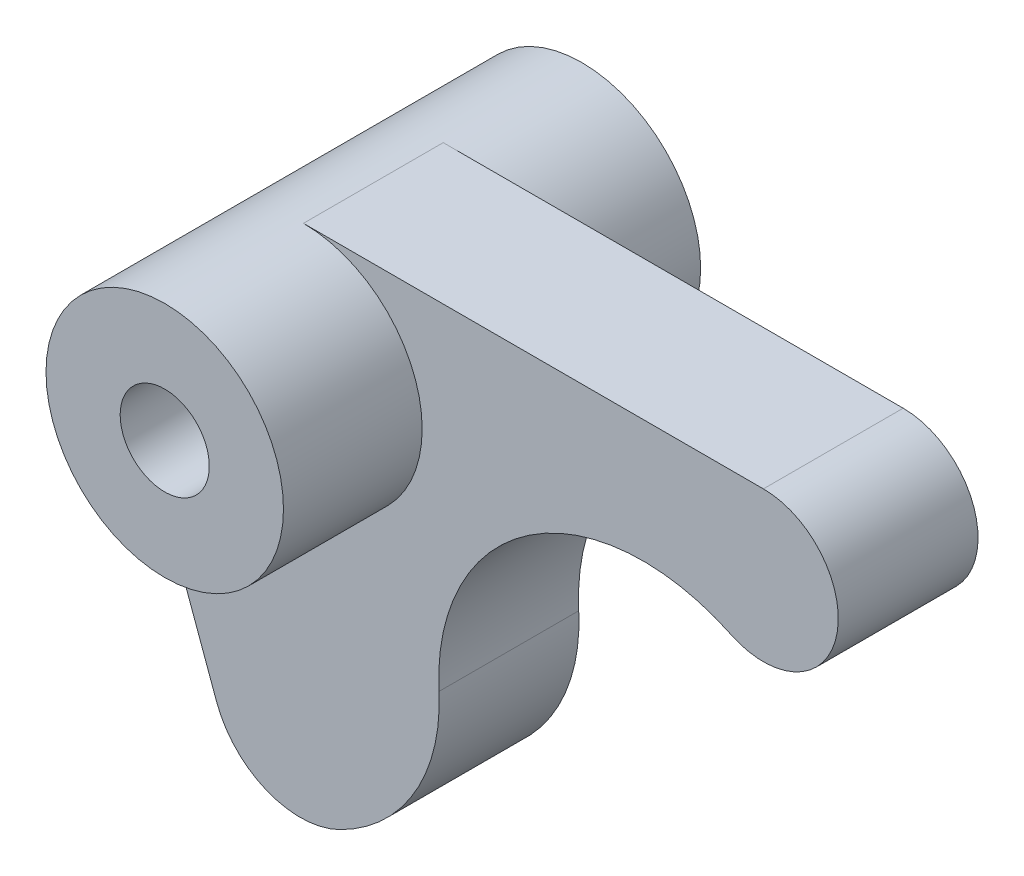
ISO-10303-21;
HEADER;
FILE_DESCRIPTION(('STEP AP214'),'2;1');
FILE_NAME('part.step','',(''),(''),'','','');
FILE_SCHEMA(('AUTOMOTIVE_DESIGN { 1 0 10303 214 1 1 1 1 }'));
ENDSEC;
DATA;
#1=APPLICATION_CONTEXT('core data for automotive mechanical design processes');
#2=APPLICATION_PROTOCOL_DEFINITION('international standard','automotive_design',2000,#1);
#3=PRODUCT_CONTEXT('',#1,'mechanical');
#4=PRODUCT('Part','Part','',(#3));
#5=PRODUCT_RELATED_PRODUCT_CATEGORY('part','',(#4));
#6=PRODUCT_DEFINITION_FORMATION('','',#4);
#7=PRODUCT_DEFINITION_CONTEXT('part definition',#1,'design');
#8=PRODUCT_DEFINITION('design','',#6,#7);
#9=PRODUCT_DEFINITION_SHAPE('','',#8);
#10=(LENGTH_UNIT() NAMED_UNIT(*) SI_UNIT(.MILLI.,.METRE.));
#11=(NAMED_UNIT(*) PLANE_ANGLE_UNIT() SI_UNIT($,.RADIAN.));
#12=(NAMED_UNIT(*) SI_UNIT($,.STERADIAN.) SOLID_ANGLE_UNIT());
#13=UNCERTAINTY_MEASURE_WITH_UNIT(LENGTH_MEASURE(1.E-05),#10,'distance_accuracy_value','');
#14=(GEOMETRIC_REPRESENTATION_CONTEXT(3) GLOBAL_UNCERTAINTY_ASSIGNED_CONTEXT((#13)) GLOBAL_UNIT_ASSIGNED_CONTEXT((#10,
#11,#12)) REPRESENTATION_CONTEXT('',''));
#15=CARTESIAN_POINT('',(0.,0.,0.));
#16=DIRECTION('',(0.,0.,1.));
#17=DIRECTION('',(1.,0.,0.));
#18=AXIS2_PLACEMENT_3D('',#15,#16,#17);
#19=CARTESIAN_POINT('',(0.,0.,7.4295));
#20=DIRECTION('',(0.,0.,-1.));
#21=DIRECTION('',(-1.,0.,0.));
#22=AXIS2_PLACEMENT_3D('',#19,#20,#21);
#23=CYLINDRICAL_SURFACE('',#22,1.5875);
#24=CARTESIAN_POINT('',(0.,0.,7.4295));
#25=DIRECTION('',(0.,0.,-1.));
#26=DIRECTION('',(-1.,0.,0.));
#27=AXIS2_PLACEMENT_3D('',#24,#25,#26);
#28=CIRCLE('',#27,1.5875);
#29=CARTESIAN_POINT('',(-1.5875,0.,7.4295));
#30=VERTEX_POINT('',#29);
#31=EDGE_CURVE('E97',#30,#30,#28,.T.);
#32=ORIENTED_EDGE('',*,*,#31,.F.);
#33=EDGE_LOOP('',(#32));
#34=FACE_BOUND('',#33,.T.);
#35=CARTESIAN_POINT('',(0.,0.,-7.4295));
#36=DIRECTION('',(0.,0.,-1.));
#37=DIRECTION('',(-1.,0.,0.));
#38=AXIS2_PLACEMENT_3D('',#35,#36,#37);
#39=CIRCLE('',#38,1.5875);
#40=CARTESIAN_POINT('',(-1.5875,0.,-7.4295));
#41=VERTEX_POINT('',#40);
#42=EDGE_CURVE('E19',#41,#41,#39,.T.);
#43=ORIENTED_EDGE('',*,*,#42,.T.);
#44=EDGE_LOOP('',(#43));
#45=FACE_BOUND('',#44,.T.);
#46=ADVANCED_FACE('F16',(#34,#45),#23,.F.);
#47=CARTESIAN_POINT('',(0.,0.,-7.4295));
#48=DIRECTION('',(0.,0.,1.));
#49=DIRECTION('',(1.,0.,0.));
#50=AXIS2_PLACEMENT_3D('',#47,#48,#49);
#51=PLANE('',#50);
#52=ORIENTED_EDGE('',*,*,#42,.F.);
#53=EDGE_LOOP('',(#52));
#54=FACE_BOUND('',#53,.T.);
#55=CARTESIAN_POINT('',(0.,0.,-7.4295));
#56=DIRECTION('',(0.,0.,1.));
#57=DIRECTION('',(1.,0.,0.));
#58=AXIS2_PLACEMENT_3D('',#55,#56,#57);
#59=CIRCLE('',#58,4.2291);
#60=CARTESIAN_POINT('',(4.2291,0.,-7.4295));
#61=VERTEX_POINT('',#60);
#62=EDGE_CURVE('E137',#61,#61,#59,.T.);
#63=ORIENTED_EDGE('',*,*,#62,.F.);
#64=EDGE_LOOP('',(#63));
#65=FACE_BOUND('',#64,.T.);
#66=ADVANCED_FACE('F149',(#54,#65),#51,.F.);
#67=CARTESIAN_POINT('',(0.,0.,7.4295));
#68=DIRECTION('',(0.,0.,1.));
#69=DIRECTION('',(1.,0.,0.));
#70=AXIS2_PLACEMENT_3D('',#67,#68,#69);
#71=PLANE('',#70);
#72=ORIENTED_EDGE('',*,*,#31,.T.);
#73=EDGE_LOOP('',(#72));
#74=FACE_BOUND('',#73,.T.);
#75=CARTESIAN_POINT('',(0.,0.,7.4295));
#76=DIRECTION('',(0.,0.,1.));
#77=DIRECTION('',(1.,0.,0.));
#78=AXIS2_PLACEMENT_3D('',#75,#76,#77);
#79=CIRCLE('',#78,4.2291);
#80=CARTESIAN_POINT('',(4.2291,0.,7.4295));
#81=VERTEX_POINT('',#80);
#82=EDGE_CURVE('E134',#81,#81,#79,.F.);
#83=ORIENTED_EDGE('',*,*,#82,.F.);
#84=EDGE_LOOP('',(#83));
#85=FACE_BOUND('',#84,.T.);
#86=ADVANCED_FACE('F152',(#74,#85),#71,.T.);
#87=CARTESIAN_POINT('',(0.,0.,2.4892));
#88=DIRECTION('',(0.,0.,1.));
#89=DIRECTION('',(1.,0.,0.));
#90=AXIS2_PLACEMENT_3D('',#87,#88,#89);
#91=PLANE('',#90);
#92=DIRECTION('',(0.34202014332572,-0.93969262078589,0.));
#93=VECTOR('',#92,1.);
#94=CARTESIAN_POINT('',(-5.0135722129856,-6.79985815491163,2.4892));
#95=LINE('',#94,#93);
#96=CARTESIAN_POINT('',(-3.09686634408832,-12.0659642494422,2.4892));
#97=VERTEX_POINT('',#96);
#98=CARTESIAN_POINT('',(-5.0135722129856,-6.79985815491163,2.4892));
#99=VERTEX_POINT('',#98);
#100=EDGE_CURVE('E93',#97,#99,#95,.F.);
#101=ORIENTED_EDGE('',*,*,#100,.F.);
#102=CARTESIAN_POINT('',(-0.113342273093115,-10.980050294383,2.4892));
#103=DIRECTION('',(0.,0.,-1.));
#104=DIRECTION('',(-1.,0.,0.));
#105=AXIS2_PLACEMENT_3D('',#102,#103,#104);
#106=CIRCLE('',#105,3.175);
#107=CARTESIAN_POINT('',(1.28733924484451,-13.8293864074641,2.4892));
#108=VERTEX_POINT('',#107);
#109=EDGE_CURVE('E87',#108,#97,#106,.T.);
#110=ORIENTED_EDGE('',*,*,#109,.F.);
#111=CARTESIAN_POINT('',(-1.51402379103074,-8.13071418130195,2.4892));
#112=DIRECTION('',(0.,0.,1.));
#113=DIRECTION('',(1.,0.,0.));
#114=AXIS2_PLACEMENT_3D('',#111,#112,#113);
#115=CIRCLE('',#114,6.35);
#116=CARTESIAN_POINT('',(4.82722270468675,-7.79740819493111,2.4892));
#117=VERTEX_POINT('',#116);
#118=EDGE_CURVE('E76',#117,#108,#115,.F.);
#119=ORIENTED_EDGE('',*,*,#118,.F.);
#120=CARTESIAN_POINT('',(12.0978280706738,-7.41525363042081,2.4892));
#121=DIRECTION('',(0.,0.,1.));
#122=DIRECTION('',(1.,0.,0.));
#123=AXIS2_PLACEMENT_3D('',#120,#121,#122);
#124=CIRCLE('',#123,7.28064176423312);
#125=CARTESIAN_POINT('',(15.2341293624782,-0.844762118659951,2.4892));
#126=VERTEX_POINT('',#125);
#127=EDGE_CURVE('E103',#117,#126,#124,.F.);
#128=ORIENTED_EDGE('',*,*,#127,.T.);
#129=CARTESIAN_POINT('',(16.383,1.56209999999999,2.4892));
#130=DIRECTION('',(0.,0.,1.));
#131=DIRECTION('',(1.,0.,0.));
#132=AXIS2_PLACEMENT_3D('',#129,#130,#131);
#133=CIRCLE('',#132,2.667);
#134=CARTESIAN_POINT('',(16.383,4.22909999999999,2.4892));
#135=VERTEX_POINT('',#134);
#136=EDGE_CURVE('E140',#135,#126,#133,.F.);
#137=ORIENTED_EDGE('',*,*,#136,.F.);
#138=DIRECTION('',(1.,0.,0.));
#139=VECTOR('',#138,1.);
#140=CARTESIAN_POINT('',(16.383,4.22909999999999,2.4892));
#141=LINE('',#140,#139);
#142=CARTESIAN_POINT('',(0.,4.2291,2.4892));
#143=VERTEX_POINT('',#142);
#144=EDGE_CURVE('E109',#143,#135,#141,.T.);
#145=ORIENTED_EDGE('',*,*,#144,.F.);
#146=CARTESIAN_POINT('',(0.,0.,2.4892));
#147=DIRECTION('',(0.,0.,1.));
#148=DIRECTION('',(1.,0.,0.));
#149=AXIS2_PLACEMENT_3D('',#146,#147,#148);
#150=CIRCLE('',#149,4.2291);
#151=CARTESIAN_POINT('',(-3.14393525179856,2.82859646158626,2.4892));
#152=VERTEX_POINT('',#151);
#153=EDGE_CURVE('E132',#152,#143,#150,.T.);
#154=ORIENTED_EDGE('',*,*,#153,.F.);
#155=CARTESIAN_POINT('',(3.937,-3.54211628973415,2.4892));
#156=DIRECTION('',(0.,0.,1.));
#157=DIRECTION('',(1.,0.,0.));
#158=AXIS2_PLACEMENT_3D('',#155,#156,#157);
#159=CIRCLE('',#158,9.525);
#160=EDGE_CURVE('E128',#99,#152,#159,.F.);
#161=ORIENTED_EDGE('',*,*,#160,.F.);
#162=EDGE_LOOP('',(#101,#110,#119,#128,#137,#145,#154,#161));
#163=FACE_BOUND('',#162,.T.);
#164=ADVANCED_FACE('F91',(#163),#91,.T.);
#165=CARTESIAN_POINT('',(-0.113342273093115,-10.980050294383,2.54290392075181));
#166=DIRECTION('',(0.,0.,-1.));
#167=DIRECTION('',(-1.,0.,0.));
#168=AXIS2_PLACEMENT_3D('',#165,#166,#167);
#169=CYLINDRICAL_SURFACE('',#168,3.175);
#170=DIRECTION('',(0.,0.,1.));
#171=VECTOR('',#170,1.);
#172=CARTESIAN_POINT('',(-3.09686634408832,-12.0659642494422,-2.4892));
#173=LINE('',#172,#171);
#174=CARTESIAN_POINT('',(-3.09686634408831,-12.0659642494422,-2.4892));
#175=VERTEX_POINT('',#174);
#176=EDGE_CURVE('E127',#175,#97,#173,.T.);
#177=ORIENTED_EDGE('',*,*,#176,.F.);
#178=CARTESIAN_POINT('',(-0.113342273093115,-10.980050294383,-2.4892));
#179=DIRECTION('',(0.,0.,-1.));
#180=DIRECTION('',(-1.,0.,0.));
#181=AXIS2_PLACEMENT_3D('',#178,#179,#180);
#182=CIRCLE('',#181,3.175);
#183=CARTESIAN_POINT('',(1.28733924484451,-13.8293864074641,-2.4892));
#184=VERTEX_POINT('',#183);
#185=EDGE_CURVE('E101',#175,#184,#182,.F.);
#186=ORIENTED_EDGE('',*,*,#185,.T.);
#187=DIRECTION('',(0.,0.,1.));
#188=VECTOR('',#187,1.);
#189=CARTESIAN_POINT('',(1.28733924484451,-13.8293864074641,-2.4892));
#190=LINE('',#189,#188);
#191=EDGE_CURVE('E81',#108,#184,#190,.F.);
#192=ORIENTED_EDGE('',*,*,#191,.F.);
#193=ORIENTED_EDGE('',*,*,#109,.T.);
#194=EDGE_LOOP('',(#177,#186,#192,#193));
#195=FACE_BOUND('',#194,.T.);
#196=ADVANCED_FACE('F100',(#195),#169,.T.);
#197=CARTESIAN_POINT('',(-1.51402379103074,-8.13071418130195,-2.4892));
#198=DIRECTION('',(0.,0.,1.));
#199=DIRECTION('',(1.,0.,0.));
#200=AXIS2_PLACEMENT_3D('',#197,#198,#199);
#201=CYLINDRICAL_SURFACE('',#200,6.35);
#202=ORIENTED_EDGE('',*,*,#118,.T.);
#203=ORIENTED_EDGE('',*,*,#191,.T.);
#204=CARTESIAN_POINT('',(-1.51402379103074,-8.13071418130195,-2.4892));
#205=DIRECTION('',(0.,0.,1.));
#206=DIRECTION('',(1.,0.,0.));
#207=AXIS2_PLACEMENT_3D('',#204,#205,#206);
#208=CIRCLE('',#207,6.35);
#209=CARTESIAN_POINT('',(4.82722270468675,-7.79740819493111,-2.4892));
#210=VERTEX_POINT('',#209);
#211=EDGE_CURVE('E124',#184,#210,#208,.T.);
#212=ORIENTED_EDGE('',*,*,#211,.T.);
#213=DIRECTION('',(0.,0.,1.));
#214=VECTOR('',#213,1.);
#215=CARTESIAN_POINT('',(4.82722270468675,-7.79740819493111,-2.4892));
#216=LINE('',#215,#214);
#217=EDGE_CURVE('E83',#210,#117,#216,.T.);
#218=ORIENTED_EDGE('',*,*,#217,.T.);
#219=EDGE_LOOP('',(#202,#203,#212,#218));
#220=FACE_BOUND('',#219,.T.);
#221=ADVANCED_FACE('F78',(#220),#201,.T.);
#222=CARTESIAN_POINT('',(12.0978280706738,-7.41525363042081,-2.4892));
#223=DIRECTION('',(0.,0.,1.));
#224=DIRECTION('',(1.,0.,0.));
#225=AXIS2_PLACEMENT_3D('',#222,#223,#224);
#226=CYLINDRICAL_SURFACE('',#225,7.28064176423312);
#227=ORIENTED_EDGE('',*,*,#127,.F.);
#228=ORIENTED_EDGE('',*,*,#217,.F.);
#229=CARTESIAN_POINT('',(12.0978280706738,-7.41525363042081,-2.4892));
#230=DIRECTION('',(0.,0.,1.));
#231=DIRECTION('',(1.,0.,0.));
#232=AXIS2_PLACEMENT_3D('',#229,#230,#231);
#233=CIRCLE('',#232,7.28064176423312);
#234=CARTESIAN_POINT('',(15.2341293624782,-0.844762118659951,-2.4892));
#235=VERTEX_POINT('',#234);
#236=EDGE_CURVE('E121',#210,#235,#233,.F.);
#237=ORIENTED_EDGE('',*,*,#236,.T.);
#238=DIRECTION('',(0.,0.,1.));
#239=VECTOR('',#238,1.);
#240=CARTESIAN_POINT('',(15.2341293624782,-0.844762118659951,-2.4892));
#241=LINE('',#240,#239);
#242=EDGE_CURVE('E112',#126,#235,#241,.F.);
#243=ORIENTED_EDGE('',*,*,#242,.F.);
#244=EDGE_LOOP('',(#227,#228,#237,#243));
#245=FACE_BOUND('',#244,.T.);
#246=ADVANCED_FACE('F188',(#245),#226,.F.);
#247=CARTESIAN_POINT('',(16.383,1.56209999999999,-2.4892));
#248=DIRECTION('',(0.,0.,1.));
#249=DIRECTION('',(1.,0.,0.));
#250=AXIS2_PLACEMENT_3D('',#247,#248,#249);
#251=CYLINDRICAL_SURFACE('',#250,2.667);
#252=ORIENTED_EDGE('',*,*,#242,.T.);
#253=CARTESIAN_POINT('',(16.383,1.56209999999999,-2.4892));
#254=DIRECTION('',(0.,0.,1.));
#255=DIRECTION('',(1.,0.,0.));
#256=AXIS2_PLACEMENT_3D('',#253,#254,#255);
#257=CIRCLE('',#256,2.667);
#258=CARTESIAN_POINT('',(16.383,4.22909999999999,-2.4892));
#259=VERTEX_POINT('',#258);
#260=EDGE_CURVE('E118',#235,#259,#257,.T.);
#261=ORIENTED_EDGE('',*,*,#260,.T.);
#262=DIRECTION('',(0.,0.,1.));
#263=VECTOR('',#262,1.);
#264=CARTESIAN_POINT('',(16.383,4.22909999999999,-2.4892));
#265=LINE('',#264,#263);
#266=EDGE_CURVE('E111',#135,#259,#265,.F.);
#267=ORIENTED_EDGE('',*,*,#266,.F.);
#268=ORIENTED_EDGE('',*,*,#136,.T.);
#269=EDGE_LOOP('',(#252,#261,#267,#268));
#270=FACE_BOUND('',#269,.T.);
#271=ADVANCED_FACE('F184',(#270),#251,.T.);
#272=CARTESIAN_POINT('',(16.383,4.22909999999999,-2.4892));
#273=DIRECTION('',(0.,1.,0.));
#274=DIRECTION('',(0.,0.,1.));
#275=AXIS2_PLACEMENT_3D('',#272,#273,#274);
#276=PLANE('',#275);
#277=DIRECTION('',(1.,0.,0.));
#278=VECTOR('',#277,1.);
#279=CARTESIAN_POINT('',(0.,4.22909999999999,-2.4892));
#280=LINE('',#279,#278);
#281=CARTESIAN_POINT('',(0.,4.2291,-2.4892));
#282=VERTEX_POINT('',#281);
#283=EDGE_CURVE('E117',#259,#282,#280,.F.);
#284=ORIENTED_EDGE('',*,*,#283,.T.);
#285=DIRECTION('',(0.,0.,1.));
#286=VECTOR('',#285,1.);
#287=CARTESIAN_POINT('',(0.,4.2291,-7.4295));
#288=LINE('',#287,#286);
#289=EDGE_CURVE('E131',#143,#282,#288,.F.);
#290=ORIENTED_EDGE('',*,*,#289,.F.);
#291=ORIENTED_EDGE('',*,*,#144,.T.);
#292=ORIENTED_EDGE('',*,*,#266,.T.);
#293=EDGE_LOOP('',(#284,#290,#291,#292));
#294=FACE_BOUND('',#293,.T.);
#295=ADVANCED_FACE('F159',(#294),#276,.T.);
#296=CARTESIAN_POINT('',(0.,0.,-7.4295));
#297=DIRECTION('',(0.,0.,1.));
#298=DIRECTION('',(1.,0.,0.));
#299=AXIS2_PLACEMENT_3D('',#296,#297,#298);
#300=CYLINDRICAL_SURFACE('',#299,4.2291);
#301=ORIENTED_EDGE('',*,*,#62,.T.);
#302=EDGE_LOOP('',(#301));
#303=FACE_BOUND('',#302,.T.);
#304=ORIENTED_EDGE('',*,*,#82,.T.);
#305=EDGE_LOOP('',(#304));
#306=FACE_BOUND('',#305,.T.);
#307=ORIENTED_EDGE('',*,*,#289,.T.);
#308=CARTESIAN_POINT('',(0.,0.,-2.4892));
#309=DIRECTION('',(0.,0.,1.));
#310=DIRECTION('',(1.,0.,0.));
#311=AXIS2_PLACEMENT_3D('',#308,#309,#310);
#312=CIRCLE('',#311,4.2291);
#313=CARTESIAN_POINT('',(-3.14393525179856,2.82859646158626,-2.4892));
#314=VERTEX_POINT('',#313);
#315=EDGE_CURVE('E115',#282,#314,#312,.F.);
#316=ORIENTED_EDGE('',*,*,#315,.T.);
#317=DIRECTION('',(0.,0.,1.));
#318=VECTOR('',#317,1.);
#319=CARTESIAN_POINT('',(-3.14393525179856,2.82859646158626,-2.4892));
#320=LINE('',#319,#318);
#321=EDGE_CURVE('E108',#152,#314,#320,.F.);
#322=ORIENTED_EDGE('',*,*,#321,.F.);
#323=ORIENTED_EDGE('',*,*,#153,.T.);
#324=EDGE_LOOP('',(#307,#316,#322,#323));
#325=FACE_BOUND('',#324,.T.);
#326=ADVANCED_FACE('F155',(#303,#306,#325),#300,.T.);
#327=CARTESIAN_POINT('',(3.937,-3.54211628973415,-2.4892));
#328=DIRECTION('',(0.,0.,1.));
#329=DIRECTION('',(1.,0.,0.));
#330=AXIS2_PLACEMENT_3D('',#327,#328,#329);
#331=CYLINDRICAL_SURFACE('',#330,9.525);
#332=ORIENTED_EDGE('',*,*,#160,.T.);
#333=ORIENTED_EDGE('',*,*,#321,.T.);
#334=CARTESIAN_POINT('',(3.937,-3.54211628973415,-2.4892));
#335=DIRECTION('',(0.,0.,1.));
#336=DIRECTION('',(1.,0.,0.));
#337=AXIS2_PLACEMENT_3D('',#334,#335,#336);
#338=CIRCLE('',#337,9.525);
#339=CARTESIAN_POINT('',(-5.0135722129856,-6.79985815491163,-2.4892));
#340=VERTEX_POINT('',#339);
#341=EDGE_CURVE('E25',#314,#340,#338,.T.);
#342=ORIENTED_EDGE('',*,*,#341,.T.);
#343=DIRECTION('',(0.,0.,1.));
#344=VECTOR('',#343,1.);
#345=CARTESIAN_POINT('',(-5.0135722129856,-6.79985815491163,-2.4892));
#346=LINE('',#345,#344);
#347=EDGE_CURVE('E33',#99,#340,#346,.F.);
#348=ORIENTED_EDGE('',*,*,#347,.F.);
#349=EDGE_LOOP('',(#332,#333,#342,#348));
#350=FACE_BOUND('',#349,.T.);
#351=ADVANCED_FACE('F158',(#350),#331,.T.);
#352=CARTESIAN_POINT('',(-5.0135722129856,-6.79985815491163,-2.4892));
#353=DIRECTION('',(-0.93969262078589,-0.34202014332572,0.));
#354=DIRECTION('',(0.34202014332572,-0.93969262078589,0.));
#355=AXIS2_PLACEMENT_3D('',#352,#353,#354);
#356=PLANE('',#355);
#357=DIRECTION('',(0.34202014332572,-0.93969262078589,0.));
#358=VECTOR('',#357,1.);
#359=CARTESIAN_POINT('',(-5.0135722129856,-6.79985815491162,-2.4892));
#360=LINE('',#359,#358);
#361=EDGE_CURVE('E10',#340,#175,#360,.T.);
#362=ORIENTED_EDGE('',*,*,#361,.T.);
#363=ORIENTED_EDGE('',*,*,#176,.T.);
#364=ORIENTED_EDGE('',*,*,#100,.T.);
#365=ORIENTED_EDGE('',*,*,#347,.T.);
#366=EDGE_LOOP('',(#362,#363,#364,#365));
#367=FACE_BOUND('',#366,.T.);
#368=ADVANCED_FACE('F191',(#367),#356,.T.);
#369=CARTESIAN_POINT('',(0.,0.,-2.4892));
#370=DIRECTION('',(0.,0.,1.));
#371=DIRECTION('',(1.,0.,0.));
#372=AXIS2_PLACEMENT_3D('',#369,#370,#371);
#373=PLANE('',#372);
#374=ORIENTED_EDGE('',*,*,#341,.F.);
#375=ORIENTED_EDGE('',*,*,#315,.F.);
#376=ORIENTED_EDGE('',*,*,#283,.F.);
#377=ORIENTED_EDGE('',*,*,#260,.F.);
#378=ORIENTED_EDGE('',*,*,#236,.F.);
#379=ORIENTED_EDGE('',*,*,#211,.F.);
#380=ORIENTED_EDGE('',*,*,#185,.F.);
#381=ORIENTED_EDGE('',*,*,#361,.F.);
#382=EDGE_LOOP('',(#374,#375,#376,#377,#378,#379,#380,#381));
#383=FACE_BOUND('',#382,.T.);
#384=ADVANCED_FACE('F174',(#383),#373,.F.);
#385=CLOSED_SHELL('',(#46,#66,#86,#164,#196,#221,#246,#271,#295,#326,#351,#368,#384));
#386=MANIFOLD_SOLID_BREP('B1',#385);
#387=ADVANCED_BREP_SHAPE_REPRESENTATION('',(#18,#386),#14);
#388=SHAPE_DEFINITION_REPRESENTATION(#9,#387);
ENDSEC;
END-ISO-10303-21;
